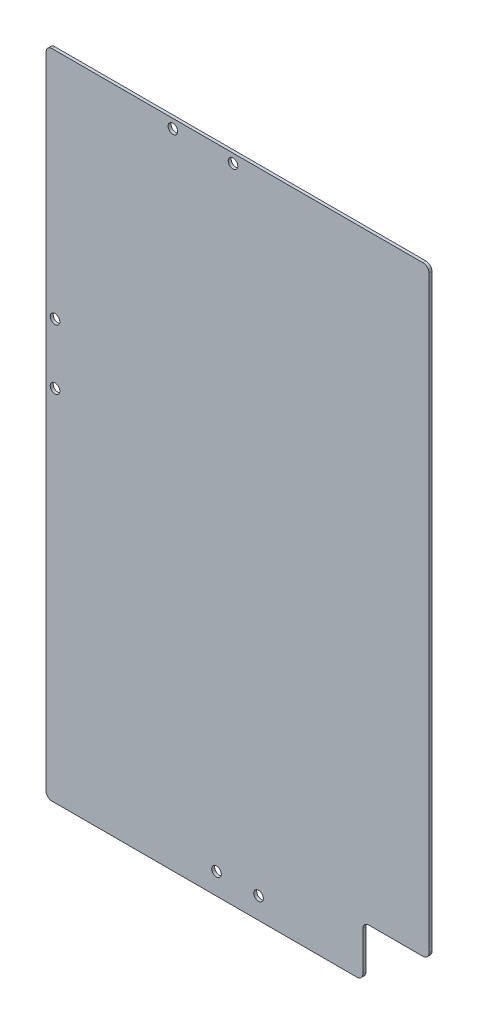
ISO-10303-21;
HEADER;
FILE_DESCRIPTION(('STEP AP214'),'2;1');
FILE_NAME('part.step','',(''),(''),'','','');
FILE_SCHEMA(('AUTOMOTIVE_DESIGN { 1 0 10303 214 1 1 1 1 }'));
ENDSEC;
DATA;
#1=APPLICATION_CONTEXT('core data for automotive mechanical design processes');
#2=APPLICATION_PROTOCOL_DEFINITION('international standard','automotive_design',2000,#1);
#3=PRODUCT_CONTEXT('',#1,'mechanical');
#4=PRODUCT('Part','Part','',(#3));
#5=PRODUCT_RELATED_PRODUCT_CATEGORY('part','',(#4));
#6=PRODUCT_DEFINITION_FORMATION('','',#4);
#7=PRODUCT_DEFINITION_CONTEXT('part definition',#1,'design');
#8=PRODUCT_DEFINITION('design','',#6,#7);
#9=PRODUCT_DEFINITION_SHAPE('','',#8);
#10=(LENGTH_UNIT() NAMED_UNIT(*) SI_UNIT(.MILLI.,.METRE.));
#11=(NAMED_UNIT(*) PLANE_ANGLE_UNIT() SI_UNIT($,.RADIAN.));
#12=(NAMED_UNIT(*) SI_UNIT($,.STERADIAN.) SOLID_ANGLE_UNIT());
#13=UNCERTAINTY_MEASURE_WITH_UNIT(LENGTH_MEASURE(1.E-05),#10,'distance_accuracy_value','');
#14=(GEOMETRIC_REPRESENTATION_CONTEXT(3) GLOBAL_UNCERTAINTY_ASSIGNED_CONTEXT((#13)) GLOBAL_UNIT_ASSIGNED_CONTEXT((#10,
#11,#12)) REPRESENTATION_CONTEXT('',''));
#15=CARTESIAN_POINT('',(0.,0.,0.));
#16=DIRECTION('',(0.,0.,1.));
#17=DIRECTION('',(1.,0.,0.));
#18=AXIS2_PLACEMENT_3D('',#15,#16,#17);
#19=CARTESIAN_POINT('',(0.,0.,1.));
#20=DIRECTION('',(0.,0.,-1.));
#21=DIRECTION('',(-1.,0.,0.));
#22=AXIS2_PLACEMENT_3D('',#19,#20,#21);
#23=PLANE('',#22);
#24=CARTESIAN_POINT('',(7.,-117.4,0.999999999999999));
#25=DIRECTION('',(0.,0.,-1.));
#26=DIRECTION('',(-1.,0.,0.));
#27=AXIS2_PLACEMENT_3D('',#24,#25,#26);
#28=CIRCLE('',#27,1.60000000000001);
#29=CARTESIAN_POINT('',(5.39999999999999,-117.4,0.999999999999999));
#30=VERTEX_POINT('',#29);
#31=EDGE_CURVE('E309',#30,#30,#28,.T.);
#32=ORIENTED_EDGE('',*,*,#31,.T.);
#33=EDGE_LOOP('',(#32));
#34=FACE_BOUND('',#33,.T.);
#35=CARTESIAN_POINT('',(-7.,-117.4,0.999999999999999));
#36=DIRECTION('',(0.,0.,-1.));
#37=DIRECTION('',(-1.,0.,0.));
#38=AXIS2_PLACEMENT_3D('',#35,#36,#37);
#39=CIRCLE('',#38,1.6);
#40=CARTESIAN_POINT('',(-8.6,-117.4,0.999999999999999));
#41=VERTEX_POINT('',#40);
#42=EDGE_CURVE('E314',#41,#41,#39,.T.);
#43=ORIENTED_EDGE('',*,*,#42,.T.);
#44=EDGE_LOOP('',(#43));
#45=FACE_BOUND('',#44,.T.);
#46=DIRECTION('',(0.,-1.,0.));
#47=VECTOR('',#46,1.);
#48=CARTESIAN_POINT('',(-63.75,-92.5,1.));
#49=LINE('',#48,#47);
#50=CARTESIAN_POINT('',(-63.75,90.5,1.));
#51=VERTEX_POINT('',#50);
#52=CARTESIAN_POINT('',(-63.75,-122.5,1.));
#53=VERTEX_POINT('',#52);
#54=EDGE_CURVE('E266',#51,#53,#49,.T.);
#55=ORIENTED_EDGE('',*,*,#54,.T.);
#56=CARTESIAN_POINT('',(-61.75,-122.5,0.999999999999999));
#57=DIRECTION('',(0.,0.,-1.));
#58=DIRECTION('',(-1.,0.,0.));
#59=AXIS2_PLACEMENT_3D('',#56,#57,#58);
#60=CIRCLE('',#59,2.);
#61=CARTESIAN_POINT('',(-61.75,-124.5,1.));
#62=VERTEX_POINT('',#61);
#63=EDGE_CURVE('E196',#53,#62,#60,.F.);
#64=ORIENTED_EDGE('',*,*,#63,.T.);
#65=DIRECTION('',(1.,0.,0.));
#66=VECTOR('',#65,1.);
#67=CARTESIAN_POINT('',(0.,-124.5,1.));
#68=LINE('',#67,#66);
#69=CARTESIAN_POINT('',(39.75,-124.5,1.));
#70=VERTEX_POINT('',#69);
#71=EDGE_CURVE('E154',#62,#70,#68,.T.);
#72=ORIENTED_EDGE('',*,*,#71,.T.);
#73=CARTESIAN_POINT('',(39.75,-122.5,0.999999999999999));
#74=DIRECTION('',(0.,0.,-1.));
#75=DIRECTION('',(-1.,0.,0.));
#76=AXIS2_PLACEMENT_3D('',#73,#74,#75);
#77=CIRCLE('',#76,2.);
#78=CARTESIAN_POINT('',(41.75,-122.5,1.));
#79=VERTEX_POINT('',#78);
#80=EDGE_CURVE('E191',#70,#79,#77,.F.);
#81=ORIENTED_EDGE('',*,*,#80,.T.);
#82=DIRECTION('',(0.,-1.,0.));
#83=VECTOR('',#82,1.);
#84=CARTESIAN_POINT('',(41.75,-124.5,1.));
#85=LINE('',#84,#83);
#86=CARTESIAN_POINT('',(41.75,-109.5,1.));
#87=VERTEX_POINT('',#86);
#88=EDGE_CURVE('E222',#87,#79,#85,.T.);
#89=ORIENTED_EDGE('',*,*,#88,.F.);
#90=CARTESIAN_POINT('',(43.75,-109.5,1.));
#91=DIRECTION('',(0.,0.,-1.));
#92=DIRECTION('',(-1.,0.,0.));
#93=AXIS2_PLACEMENT_3D('',#90,#91,#92);
#94=CIRCLE('',#93,2.);
#95=CARTESIAN_POINT('',(43.75,-107.5,1.));
#96=VERTEX_POINT('',#95);
#97=EDGE_CURVE('E50',#87,#96,#94,.T.);
#98=ORIENTED_EDGE('',*,*,#97,.T.);
#99=DIRECTION('',(-1.,0.,0.));
#100=VECTOR('',#99,1.);
#101=CARTESIAN_POINT('',(63.75,-107.5,1.));
#102=LINE('',#101,#100);
#103=CARTESIAN_POINT('',(61.75,-107.5,1.));
#104=VERTEX_POINT('',#103);
#105=EDGE_CURVE('E220',#104,#96,#102,.T.);
#106=ORIENTED_EDGE('',*,*,#105,.F.);
#107=CARTESIAN_POINT('',(61.75,-105.5,1.));
#108=DIRECTION('',(0.,0.,-1.));
#109=DIRECTION('',(-1.,0.,0.));
#110=AXIS2_PLACEMENT_3D('',#107,#108,#109);
#111=CIRCLE('',#110,2.);
#112=CARTESIAN_POINT('',(63.75,-105.5,1.));
#113=VERTEX_POINT('',#112);
#114=EDGE_CURVE('E193',#104,#113,#111,.F.);
#115=ORIENTED_EDGE('',*,*,#114,.T.);
#116=DIRECTION('',(0.,1.,0.));
#117=VECTOR('',#116,1.);
#118=CARTESIAN_POINT('',(63.75,-92.5,1.));
#119=LINE('',#118,#117);
#120=CARTESIAN_POINT('',(63.75,90.5,1.));
#121=VERTEX_POINT('',#120);
#122=EDGE_CURVE('E274',#113,#121,#119,.T.);
#123=ORIENTED_EDGE('',*,*,#122,.T.);
#124=CARTESIAN_POINT('',(61.75,90.5,1.));
#125=DIRECTION('',(0.,0.,-1.));
#126=DIRECTION('',(-1.,0.,0.));
#127=AXIS2_PLACEMENT_3D('',#124,#125,#126);
#128=CIRCLE('',#127,2.);
#129=CARTESIAN_POINT('',(61.75,92.5,1.));
#130=VERTEX_POINT('',#129);
#131=EDGE_CURVE('E64',#121,#130,#128,.F.);
#132=ORIENTED_EDGE('',*,*,#131,.T.);
#133=DIRECTION('',(-1.,0.,0.));
#134=VECTOR('',#133,1.);
#135=CARTESIAN_POINT('',(-63.75,92.5,1.));
#136=LINE('',#135,#134);
#137=CARTESIAN_POINT('',(-61.75,92.5,1.));
#138=VERTEX_POINT('',#137);
#139=EDGE_CURVE('E275',#130,#138,#136,.T.);
#140=ORIENTED_EDGE('',*,*,#139,.T.);
#141=CARTESIAN_POINT('',(-61.75,90.5,1.));
#142=DIRECTION('',(0.,0.,-1.));
#143=DIRECTION('',(-1.,0.,0.));
#144=AXIS2_PLACEMENT_3D('',#141,#142,#143);
#145=CIRCLE('',#144,2.);
#146=EDGE_CURVE('E189',#138,#51,#145,.F.);
#147=ORIENTED_EDGE('',*,*,#146,.T.);
#148=EDGE_LOOP('',(#55,#64,#72,#81,#89,#98,#106,#115,#123,#132,#140,#147));
#149=FACE_BOUND('',#148,.T.);
#150=CARTESIAN_POINT('',(-21.5,89.5,1.));
#151=DIRECTION('',(0.,0.,1.));
#152=DIRECTION('',(1.,0.,0.));
#153=AXIS2_PLACEMENT_3D('',#150,#151,#152);
#154=CIRCLE('',#153,1.60000000000001);
#155=CARTESIAN_POINT('',(-19.9,89.5,1.));
#156=VERTEX_POINT('',#155);
#157=EDGE_CURVE('E265',#156,#156,#154,.T.);
#158=ORIENTED_EDGE('',*,*,#157,.F.);
#159=EDGE_LOOP('',(#158));
#160=FACE_BOUND('',#159,.T.);
#161=CARTESIAN_POINT('',(-1.5,89.5,1.));
#162=DIRECTION('',(0.,0.,1.));
#163=DIRECTION('',(1.,0.,0.));
#164=AXIS2_PLACEMENT_3D('',#161,#162,#163);
#165=CIRCLE('',#164,1.6);
#166=CARTESIAN_POINT('',(0.100000000000003,89.5,1.));
#167=VERTEX_POINT('',#166);
#168=EDGE_CURVE('E285',#167,#167,#165,.T.);
#169=ORIENTED_EDGE('',*,*,#168,.F.);
#170=EDGE_LOOP('',(#169));
#171=FACE_BOUND('',#170,.T.);
#172=CARTESIAN_POINT('',(-60.75,15.,1.));
#173=DIRECTION('',(0.,0.,1.));
#174=DIRECTION('',(1.,0.,0.));
#175=AXIS2_PLACEMENT_3D('',#172,#173,#174);
#176=CIRCLE('',#175,1.6);
#177=CARTESIAN_POINT('',(-59.15,15.,1.));
#178=VERTEX_POINT('',#177);
#179=EDGE_CURVE('E295',#178,#178,#176,.T.);
#180=ORIENTED_EDGE('',*,*,#179,.F.);
#181=EDGE_LOOP('',(#180));
#182=FACE_BOUND('',#181,.T.);
#183=CARTESIAN_POINT('',(-60.75,-5.,1.));
#184=DIRECTION('',(0.,0.,1.));
#185=DIRECTION('',(1.,0.,0.));
#186=AXIS2_PLACEMENT_3D('',#183,#184,#185);
#187=CIRCLE('',#186,1.6);
#188=CARTESIAN_POINT('',(-59.15,-5.,1.));
#189=VERTEX_POINT('',#188);
#190=EDGE_CURVE('E302',#189,#189,#187,.T.);
#191=ORIENTED_EDGE('',*,*,#190,.F.);
#192=EDGE_LOOP('',(#191));
#193=FACE_BOUND('',#192,.T.);
#194=ADVANCED_FACE('F41',(#34,#45,#149,#160,#171,#182,#193),#23,.F.);
#195=CARTESIAN_POINT('',(0.,0.,0.));
#196=DIRECTION('',(0.,0.,-1.));
#197=DIRECTION('',(-1.,0.,0.));
#198=AXIS2_PLACEMENT_3D('',#195,#196,#197);
#199=PLANE('',#198);
#200=DIRECTION('',(1.,0.,0.));
#201=VECTOR('',#200,1.);
#202=CARTESIAN_POINT('',(63.75,-124.5,0.));
#203=LINE('',#202,#201);
#204=CARTESIAN_POINT('',(-61.75,-124.5,0.));
#205=VERTEX_POINT('',#204);
#206=CARTESIAN_POINT('',(39.75,-124.5,0.));
#207=VERTEX_POINT('',#206);
#208=EDGE_CURVE('E151',#205,#207,#203,.T.);
#209=ORIENTED_EDGE('',*,*,#208,.F.);
#210=CARTESIAN_POINT('',(-61.75,-122.5,0.));
#211=DIRECTION('',(0.,0.,-1.));
#212=DIRECTION('',(-1.,0.,0.));
#213=AXIS2_PLACEMENT_3D('',#210,#211,#212);
#214=CIRCLE('',#213,2.);
#215=CARTESIAN_POINT('',(-63.75,-122.5,0.));
#216=VERTEX_POINT('',#215);
#217=EDGE_CURVE('E132',#205,#216,#214,.T.);
#218=ORIENTED_EDGE('',*,*,#217,.T.);
#219=DIRECTION('',(0.,-1.,0.));
#220=VECTOR('',#219,1.);
#221=CARTESIAN_POINT('',(-63.75,-92.5,0.));
#222=LINE('',#221,#220);
#223=CARTESIAN_POINT('',(-63.75,90.5,0.));
#224=VERTEX_POINT('',#223);
#225=EDGE_CURVE('E270',#224,#216,#222,.T.);
#226=ORIENTED_EDGE('',*,*,#225,.F.);
#227=CARTESIAN_POINT('',(-61.75,90.5,0.));
#228=DIRECTION('',(0.,0.,-1.));
#229=DIRECTION('',(-1.,0.,0.));
#230=AXIS2_PLACEMENT_3D('',#227,#228,#229);
#231=CIRCLE('',#230,2.);
#232=CARTESIAN_POINT('',(-61.75,92.5,0.));
#233=VERTEX_POINT('',#232);
#234=EDGE_CURVE('E155',#224,#233,#231,.T.);
#235=ORIENTED_EDGE('',*,*,#234,.T.);
#236=DIRECTION('',(-1.,0.,0.));
#237=VECTOR('',#236,1.);
#238=CARTESIAN_POINT('',(-63.75,92.5,0.));
#239=LINE('',#238,#237);
#240=CARTESIAN_POINT('',(61.75,92.5,0.));
#241=VERTEX_POINT('',#240);
#242=EDGE_CURVE('E264',#241,#233,#239,.T.);
#243=ORIENTED_EDGE('',*,*,#242,.F.);
#244=CARTESIAN_POINT('',(61.75,90.5,0.));
#245=DIRECTION('',(0.,0.,-1.));
#246=DIRECTION('',(-1.,0.,0.));
#247=AXIS2_PLACEMENT_3D('',#244,#245,#246);
#248=CIRCLE('',#247,2.);
#249=CARTESIAN_POINT('',(63.75,90.5,0.));
#250=VERTEX_POINT('',#249);
#251=EDGE_CURVE('E144',#241,#250,#248,.T.);
#252=ORIENTED_EDGE('',*,*,#251,.T.);
#253=DIRECTION('',(0.,1.,0.));
#254=VECTOR('',#253,1.);
#255=CARTESIAN_POINT('',(63.75,-92.5,0.));
#256=LINE('',#255,#254);
#257=CARTESIAN_POINT('',(63.75,-105.5,0.));
#258=VERTEX_POINT('',#257);
#259=EDGE_CURVE('E258',#258,#250,#256,.T.);
#260=ORIENTED_EDGE('',*,*,#259,.F.);
#261=CARTESIAN_POINT('',(61.75,-105.5,0.));
#262=DIRECTION('',(0.,0.,-1.));
#263=DIRECTION('',(-1.,0.,0.));
#264=AXIS2_PLACEMENT_3D('',#261,#262,#263);
#265=CIRCLE('',#264,2.);
#266=CARTESIAN_POINT('',(61.75,-107.5,0.));
#267=VERTEX_POINT('',#266);
#268=EDGE_CURVE('E250',#258,#267,#265,.T.);
#269=ORIENTED_EDGE('',*,*,#268,.T.);
#270=DIRECTION('',(1.,0.,0.));
#271=VECTOR('',#270,1.);
#272=CARTESIAN_POINT('',(0.,-107.5,0.));
#273=LINE('',#272,#271);
#274=CARTESIAN_POINT('',(43.75,-107.5,0.));
#275=VERTEX_POINT('',#274);
#276=EDGE_CURVE('E164',#275,#267,#273,.T.);
#277=ORIENTED_EDGE('',*,*,#276,.F.);
#278=CARTESIAN_POINT('',(43.75,-109.5,0.));
#279=DIRECTION('',(0.,0.,-1.));
#280=DIRECTION('',(-1.,0.,0.));
#281=AXIS2_PLACEMENT_3D('',#278,#279,#280);
#282=CIRCLE('',#281,2.);
#283=CARTESIAN_POINT('',(41.75,-109.5,0.));
#284=VERTEX_POINT('',#283);
#285=EDGE_CURVE('E12',#275,#284,#282,.F.);
#286=ORIENTED_EDGE('',*,*,#285,.T.);
#287=DIRECTION('',(0.,1.,0.));
#288=VECTOR('',#287,1.);
#289=CARTESIAN_POINT('',(41.75,0.,0.));
#290=LINE('',#289,#288);
#291=CARTESIAN_POINT('',(41.75,-122.5,0.));
#292=VERTEX_POINT('',#291);
#293=EDGE_CURVE('E170',#292,#284,#290,.T.);
#294=ORIENTED_EDGE('',*,*,#293,.F.);
#295=CARTESIAN_POINT('',(39.75,-122.5,0.));
#296=DIRECTION('',(0.,0.,-1.));
#297=DIRECTION('',(-1.,0.,0.));
#298=AXIS2_PLACEMENT_3D('',#295,#296,#297);
#299=CIRCLE('',#298,2.);
#300=EDGE_CURVE('E162',#292,#207,#299,.T.);
#301=ORIENTED_EDGE('',*,*,#300,.T.);
#302=EDGE_LOOP('',(#209,#218,#226,#235,#243,#252,#260,#269,#277,#286,#294,#301));
#303=FACE_BOUND('',#302,.T.);
#304=CARTESIAN_POINT('',(7.,-117.4,0.));
#305=DIRECTION('',(0.,0.,-1.));
#306=DIRECTION('',(-1.,0.,0.));
#307=AXIS2_PLACEMENT_3D('',#304,#305,#306);
#308=CIRCLE('',#307,1.60000000000001);
#309=CARTESIAN_POINT('',(5.39999999999999,-117.4,0.));
#310=VERTEX_POINT('',#309);
#311=EDGE_CURVE('E317',#310,#310,#308,.T.);
#312=ORIENTED_EDGE('',*,*,#311,.F.);
#313=EDGE_LOOP('',(#312));
#314=FACE_BOUND('',#313,.T.);
#315=CARTESIAN_POINT('',(-7.,-117.4,0.));
#316=DIRECTION('',(0.,0.,-1.));
#317=DIRECTION('',(-1.,0.,0.));
#318=AXIS2_PLACEMENT_3D('',#315,#316,#317);
#319=CIRCLE('',#318,1.6);
#320=CARTESIAN_POINT('',(-8.6,-117.4,0.));
#321=VERTEX_POINT('',#320);
#322=EDGE_CURVE('E166',#321,#321,#319,.T.);
#323=ORIENTED_EDGE('',*,*,#322,.F.);
#324=EDGE_LOOP('',(#323));
#325=FACE_BOUND('',#324,.T.);
#326=CARTESIAN_POINT('',(-60.75,15.,0.));
#327=DIRECTION('',(0.,0.,1.));
#328=DIRECTION('',(1.,0.,0.));
#329=AXIS2_PLACEMENT_3D('',#326,#327,#328);
#330=CIRCLE('',#329,1.6);
#331=CARTESIAN_POINT('',(-59.15,15.,0.));
#332=VERTEX_POINT('',#331);
#333=EDGE_CURVE('E297',#332,#332,#330,.T.);
#334=ORIENTED_EDGE('',*,*,#333,.T.);
#335=EDGE_LOOP('',(#334));
#336=FACE_BOUND('',#335,.T.);
#337=CARTESIAN_POINT('',(-21.5,89.5,0.));
#338=DIRECTION('',(0.,0.,1.));
#339=DIRECTION('',(1.,0.,0.));
#340=AXIS2_PLACEMENT_3D('',#337,#338,#339);
#341=CIRCLE('',#340,1.60000000000001);
#342=CARTESIAN_POINT('',(-19.9,89.5,0.));
#343=VERTEX_POINT('',#342);
#344=EDGE_CURVE('E280',#343,#343,#341,.T.);
#345=ORIENTED_EDGE('',*,*,#344,.T.);
#346=EDGE_LOOP('',(#345));
#347=FACE_BOUND('',#346,.T.);
#348=CARTESIAN_POINT('',(-1.5,89.5,0.));
#349=DIRECTION('',(0.,0.,1.));
#350=DIRECTION('',(1.,0.,0.));
#351=AXIS2_PLACEMENT_3D('',#348,#349,#350);
#352=CIRCLE('',#351,1.6);
#353=CARTESIAN_POINT('',(0.100000000000003,89.5,0.));
#354=VERTEX_POINT('',#353);
#355=EDGE_CURVE('E290',#354,#354,#352,.T.);
#356=ORIENTED_EDGE('',*,*,#355,.T.);
#357=EDGE_LOOP('',(#356));
#358=FACE_BOUND('',#357,.T.);
#359=CARTESIAN_POINT('',(-60.75,-5.,0.));
#360=DIRECTION('',(0.,0.,1.));
#361=DIRECTION('',(1.,0.,0.));
#362=AXIS2_PLACEMENT_3D('',#359,#360,#361);
#363=CIRCLE('',#362,1.6);
#364=CARTESIAN_POINT('',(-59.15,-5.,0.));
#365=VERTEX_POINT('',#364);
#366=EDGE_CURVE('E304',#365,#365,#363,.T.);
#367=ORIENTED_EDGE('',*,*,#366,.T.);
#368=EDGE_LOOP('',(#367));
#369=FACE_BOUND('',#368,.T.);
#370=ADVANCED_FACE('F158',(#303,#314,#325,#336,#347,#358,#369),#199,.T.);
#371=CARTESIAN_POINT('',(63.75,-92.5,1.));
#372=DIRECTION('',(-1.,0.,0.));
#373=DIRECTION('',(0.,0.,1.));
#374=AXIS2_PLACEMENT_3D('',#371,#372,#373);
#375=PLANE('',#374);
#376=ORIENTED_EDGE('',*,*,#259,.T.);
#377=DIRECTION('',(0.,0.,-1.));
#378=VECTOR('',#377,1.);
#379=CARTESIAN_POINT('',(63.75,90.5,1.));
#380=LINE('',#379,#378);
#381=EDGE_CURVE('E204',#250,#121,#380,.F.);
#382=ORIENTED_EDGE('',*,*,#381,.T.);
#383=ORIENTED_EDGE('',*,*,#122,.F.);
#384=DIRECTION('',(0.,0.,1.));
#385=VECTOR('',#384,1.);
#386=CARTESIAN_POINT('',(63.75,-105.5,1.));
#387=LINE('',#386,#385);
#388=EDGE_CURVE('E202',#113,#258,#387,.F.);
#389=ORIENTED_EDGE('',*,*,#388,.T.);
#390=EDGE_LOOP('',(#376,#382,#383,#389));
#391=FACE_BOUND('',#390,.T.);
#392=ADVANCED_FACE('F330',(#391),#375,.F.);
#393=CARTESIAN_POINT('',(-63.75,92.5,1.));
#394=DIRECTION('',(0.,-1.,0.));
#395=DIRECTION('',(0.,0.,-1.));
#396=AXIS2_PLACEMENT_3D('',#393,#394,#395);
#397=PLANE('',#396);
#398=ORIENTED_EDGE('',*,*,#139,.F.);
#399=DIRECTION('',(0.,0.,-1.));
#400=VECTOR('',#399,1.);
#401=CARTESIAN_POINT('',(61.75,92.5,1.));
#402=LINE('',#401,#400);
#403=EDGE_CURVE('E199',#130,#241,#402,.T.);
#404=ORIENTED_EDGE('',*,*,#403,.T.);
#405=ORIENTED_EDGE('',*,*,#242,.T.);
#406=DIRECTION('',(0.,0.,-1.));
#407=VECTOR('',#406,1.);
#408=CARTESIAN_POINT('',(-61.75,92.5,1.));
#409=LINE('',#408,#407);
#410=EDGE_CURVE('E57',#233,#138,#409,.F.);
#411=ORIENTED_EDGE('',*,*,#410,.T.);
#412=EDGE_LOOP('',(#398,#404,#405,#411));
#413=FACE_BOUND('',#412,.T.);
#414=ADVANCED_FACE('F370',(#413),#397,.F.);
#415=CARTESIAN_POINT('',(-63.75,-92.5,1.));
#416=DIRECTION('',(1.,0.,0.));
#417=DIRECTION('',(0.,0.,-1.));
#418=AXIS2_PLACEMENT_3D('',#415,#416,#417);
#419=PLANE('',#418);
#420=ORIENTED_EDGE('',*,*,#225,.T.);
#421=DIRECTION('',(0.,0.,-1.));
#422=VECTOR('',#421,1.);
#423=CARTESIAN_POINT('',(-63.75,-122.5,1.));
#424=LINE('',#423,#422);
#425=EDGE_CURVE('E137',#216,#53,#424,.F.);
#426=ORIENTED_EDGE('',*,*,#425,.T.);
#427=ORIENTED_EDGE('',*,*,#54,.F.);
#428=DIRECTION('',(0.,0.,-1.));
#429=VECTOR('',#428,1.);
#430=CARTESIAN_POINT('',(-63.75,90.5,1.));
#431=LINE('',#430,#429);
#432=EDGE_CURVE('E143',#51,#224,#431,.T.);
#433=ORIENTED_EDGE('',*,*,#432,.T.);
#434=EDGE_LOOP('',(#420,#426,#427,#433));
#435=FACE_BOUND('',#434,.T.);
#436=ADVANCED_FACE('F367',(#435),#419,.F.);
#437=CARTESIAN_POINT('',(-21.5,89.5,1.));
#438=DIRECTION('',(0.,0.,-1.));
#439=DIRECTION('',(-1.,0.,0.));
#440=AXIS2_PLACEMENT_3D('',#437,#438,#439);
#441=CYLINDRICAL_SURFACE('',#440,1.60000000000001);
#442=ORIENTED_EDGE('',*,*,#157,.T.);
#443=EDGE_LOOP('',(#442));
#444=FACE_BOUND('',#443,.T.);
#445=ORIENTED_EDGE('',*,*,#344,.F.);
#446=EDGE_LOOP('',(#445));
#447=FACE_BOUND('',#446,.T.);
#448=ADVANCED_FACE('F364',(#444,#447),#441,.F.);
#449=CARTESIAN_POINT('',(-1.5,89.5,1.));
#450=DIRECTION('',(0.,0.,-1.));
#451=DIRECTION('',(-1.,0.,0.));
#452=AXIS2_PLACEMENT_3D('',#449,#450,#451);
#453=CYLINDRICAL_SURFACE('',#452,1.6);
#454=ORIENTED_EDGE('',*,*,#168,.T.);
#455=EDGE_LOOP('',(#454));
#456=FACE_BOUND('',#455,.T.);
#457=ORIENTED_EDGE('',*,*,#355,.F.);
#458=EDGE_LOOP('',(#457));
#459=FACE_BOUND('',#458,.T.);
#460=ADVANCED_FACE('F354',(#456,#459),#453,.F.);
#461=CARTESIAN_POINT('',(-60.75,15.,1.));
#462=DIRECTION('',(0.,0.,-1.));
#463=DIRECTION('',(-1.,0.,0.));
#464=AXIS2_PLACEMENT_3D('',#461,#462,#463);
#465=CYLINDRICAL_SURFACE('',#464,1.6);
#466=ORIENTED_EDGE('',*,*,#179,.T.);
#467=EDGE_LOOP('',(#466));
#468=FACE_BOUND('',#467,.T.);
#469=ORIENTED_EDGE('',*,*,#333,.F.);
#470=EDGE_LOOP('',(#469));
#471=FACE_BOUND('',#470,.T.);
#472=ADVANCED_FACE('F345',(#468,#471),#465,.F.);
#473=CARTESIAN_POINT('',(-60.75,-5.,1.));
#474=DIRECTION('',(0.,0.,-1.));
#475=DIRECTION('',(-1.,0.,0.));
#476=AXIS2_PLACEMENT_3D('',#473,#474,#475);
#477=CYLINDRICAL_SURFACE('',#476,1.6);
#478=ORIENTED_EDGE('',*,*,#190,.T.);
#479=EDGE_LOOP('',(#478));
#480=FACE_BOUND('',#479,.T.);
#481=ORIENTED_EDGE('',*,*,#366,.F.);
#482=EDGE_LOOP('',(#481));
#483=FACE_BOUND('',#482,.T.);
#484=ADVANCED_FACE('F342',(#480,#483),#477,.F.);
#485=CARTESIAN_POINT('',(-7.,-117.4,10.));
#486=DIRECTION('',(0.,0.,-1.));
#487=DIRECTION('',(-1.,0.,0.));
#488=AXIS2_PLACEMENT_3D('',#485,#486,#487);
#489=CYLINDRICAL_SURFACE('',#488,1.6);
#490=ORIENTED_EDGE('',*,*,#322,.T.);
#491=EDGE_LOOP('',(#490));
#492=FACE_BOUND('',#491,.T.);
#493=ORIENTED_EDGE('',*,*,#42,.F.);
#494=EDGE_LOOP('',(#493));
#495=FACE_BOUND('',#494,.T.);
#496=ADVANCED_FACE('F344',(#492,#495),#489,.F.);
#497=CARTESIAN_POINT('',(7.,-117.4,10.));
#498=DIRECTION('',(0.,0.,-1.));
#499=DIRECTION('',(-1.,0.,0.));
#500=AXIS2_PLACEMENT_3D('',#497,#498,#499);
#501=CYLINDRICAL_SURFACE('',#500,1.60000000000001);
#502=ORIENTED_EDGE('',*,*,#311,.T.);
#503=EDGE_LOOP('',(#502));
#504=FACE_BOUND('',#503,.T.);
#505=ORIENTED_EDGE('',*,*,#31,.F.);
#506=EDGE_LOOP('',(#505));
#507=FACE_BOUND('',#506,.T.);
#508=ADVANCED_FACE('F326',(#504,#507),#501,.F.);
#509=CARTESIAN_POINT('',(63.75,-124.5,10.));
#510=DIRECTION('',(0.,1.,0.));
#511=DIRECTION('',(0.,0.,1.));
#512=AXIS2_PLACEMENT_3D('',#509,#510,#511);
#513=PLANE('',#512);
#514=ORIENTED_EDGE('',*,*,#71,.F.);
#515=DIRECTION('',(0.,0.,-1.));
#516=VECTOR('',#515,1.);
#517=CARTESIAN_POINT('',(-61.75,-124.5,10.));
#518=LINE('',#517,#516);
#519=EDGE_CURVE('E136',#62,#205,#518,.T.);
#520=ORIENTED_EDGE('',*,*,#519,.T.);
#521=ORIENTED_EDGE('',*,*,#208,.T.);
#522=DIRECTION('',(0.,0.,1.));
#523=VECTOR('',#522,1.);
#524=CARTESIAN_POINT('',(39.75,-124.5,10.));
#525=LINE('',#524,#523);
#526=EDGE_CURVE('E156',#207,#70,#525,.T.);
#527=ORIENTED_EDGE('',*,*,#526,.T.);
#528=EDGE_LOOP('',(#514,#520,#521,#527));
#529=FACE_BOUND('',#528,.T.);
#530=ADVANCED_FACE('F149',(#529),#513,.F.);
#531=CARTESIAN_POINT('',(41.75,-124.5,-9.));
#532=DIRECTION('',(-1.,0.,0.));
#533=DIRECTION('',(0.,0.,1.));
#534=AXIS2_PLACEMENT_3D('',#531,#532,#533);
#535=PLANE('',#534);
#536=ORIENTED_EDGE('',*,*,#293,.T.);
#537=DIRECTION('',(0.,0.,1.));
#538=VECTOR('',#537,1.);
#539=CARTESIAN_POINT('',(41.75,-109.5,1.));
#540=LINE('',#539,#538);
#541=EDGE_CURVE('E213',#284,#87,#540,.T.);
#542=ORIENTED_EDGE('',*,*,#541,.T.);
#543=ORIENTED_EDGE('',*,*,#88,.T.);
#544=DIRECTION('',(0.,0.,1.));
#545=VECTOR('',#544,1.);
#546=CARTESIAN_POINT('',(41.75,-122.5,-9.));
#547=LINE('',#546,#545);
#548=EDGE_CURVE('E211',#79,#292,#547,.F.);
#549=ORIENTED_EDGE('',*,*,#548,.T.);
#550=EDGE_LOOP('',(#536,#542,#543,#549));
#551=FACE_BOUND('',#550,.T.);
#552=ADVANCED_FACE('F235',(#551),#535,.F.);
#553=CARTESIAN_POINT('',(63.75,-107.5,-9.));
#554=DIRECTION('',(0.,1.,0.));
#555=DIRECTION('',(-1.,0.,0.));
#556=AXIS2_PLACEMENT_3D('',#553,#554,#555);
#557=PLANE('',#556);
#558=ORIENTED_EDGE('',*,*,#276,.T.);
#559=DIRECTION('',(0.,0.,1.));
#560=VECTOR('',#559,1.);
#561=CARTESIAN_POINT('',(61.75,-107.5,-9.));
#562=LINE('',#561,#560);
#563=EDGE_CURVE('E208',#267,#104,#562,.T.);
#564=ORIENTED_EDGE('',*,*,#563,.T.);
#565=ORIENTED_EDGE('',*,*,#105,.T.);
#566=DIRECTION('',(0.,0.,1.));
#567=VECTOR('',#566,1.);
#568=CARTESIAN_POINT('',(43.75,-107.5,0.));
#569=LINE('',#568,#567);
#570=EDGE_CURVE('E206',#96,#275,#569,.F.);
#571=ORIENTED_EDGE('',*,*,#570,.T.);
#572=EDGE_LOOP('',(#558,#564,#565,#571));
#573=FACE_BOUND('',#572,.T.);
#574=ADVANCED_FACE('F227',(#573),#557,.F.);
#575=CARTESIAN_POINT('',(-61.75,-122.5,10.));
#576=DIRECTION('',(0.,0.,-1.));
#577=DIRECTION('',(-1.,0.,0.));
#578=AXIS2_PLACEMENT_3D('',#575,#576,#577);
#579=CYLINDRICAL_SURFACE('',#578,2.);
#580=ORIENTED_EDGE('',*,*,#63,.F.);
#581=ORIENTED_EDGE('',*,*,#425,.F.);
#582=ORIENTED_EDGE('',*,*,#217,.F.);
#583=ORIENTED_EDGE('',*,*,#519,.F.);
#584=EDGE_LOOP('',(#580,#581,#582,#583));
#585=FACE_BOUND('',#584,.T.);
#586=ADVANCED_FACE('F135',(#585),#579,.T.);
#587=CARTESIAN_POINT('',(61.75,90.5,1.));
#588=DIRECTION('',(0.,0.,-1.));
#589=DIRECTION('',(-1.,0.,0.));
#590=AXIS2_PLACEMENT_3D('',#587,#588,#589);
#591=CYLINDRICAL_SURFACE('',#590,2.);
#592=ORIENTED_EDGE('',*,*,#131,.F.);
#593=ORIENTED_EDGE('',*,*,#381,.F.);
#594=ORIENTED_EDGE('',*,*,#251,.F.);
#595=ORIENTED_EDGE('',*,*,#403,.F.);
#596=EDGE_LOOP('',(#592,#593,#594,#595));
#597=FACE_BOUND('',#596,.T.);
#598=ADVANCED_FACE('F379',(#597),#591,.T.);
#599=CARTESIAN_POINT('',(61.75,-105.5,-9.));
#600=DIRECTION('',(0.,0.,1.));
#601=DIRECTION('',(1.,0.,0.));
#602=AXIS2_PLACEMENT_3D('',#599,#600,#601);
#603=CYLINDRICAL_SURFACE('',#602,2.);
#604=ORIENTED_EDGE('',*,*,#268,.F.);
#605=ORIENTED_EDGE('',*,*,#388,.F.);
#606=ORIENTED_EDGE('',*,*,#114,.F.);
#607=ORIENTED_EDGE('',*,*,#563,.F.);
#608=EDGE_LOOP('',(#604,#605,#606,#607));
#609=FACE_BOUND('',#608,.T.);
#610=ADVANCED_FACE('F382',(#609),#603,.T.);
#611=CARTESIAN_POINT('',(43.75,-109.5,-9.));
#612=DIRECTION('',(0.,0.,-1.));
#613=DIRECTION('',(-1.,0.,0.));
#614=AXIS2_PLACEMENT_3D('',#611,#612,#613);
#615=CYLINDRICAL_SURFACE('',#614,2.);
#616=ORIENTED_EDGE('',*,*,#285,.F.);
#617=ORIENTED_EDGE('',*,*,#570,.F.);
#618=ORIENTED_EDGE('',*,*,#97,.F.);
#619=ORIENTED_EDGE('',*,*,#541,.F.);
#620=EDGE_LOOP('',(#616,#617,#618,#619));
#621=FACE_BOUND('',#620,.T.);
#622=ADVANCED_FACE('F232',(#621),#615,.F.);
#623=CARTESIAN_POINT('',(39.75,-122.5,10.));
#624=DIRECTION('',(0.,0.,1.));
#625=DIRECTION('',(1.,0.,0.));
#626=AXIS2_PLACEMENT_3D('',#623,#624,#625);
#627=CYLINDRICAL_SURFACE('',#626,2.);
#628=ORIENTED_EDGE('',*,*,#300,.F.);
#629=ORIENTED_EDGE('',*,*,#548,.F.);
#630=ORIENTED_EDGE('',*,*,#80,.F.);
#631=ORIENTED_EDGE('',*,*,#526,.F.);
#632=EDGE_LOOP('',(#628,#629,#630,#631));
#633=FACE_BOUND('',#632,.T.);
#634=ADVANCED_FACE('F388',(#633),#627,.T.);
#635=CARTESIAN_POINT('',(-61.75,90.5,1.));
#636=DIRECTION('',(0.,0.,-1.));
#637=DIRECTION('',(-1.,0.,0.));
#638=AXIS2_PLACEMENT_3D('',#635,#636,#637);
#639=CYLINDRICAL_SURFACE('',#638,2.);
#640=ORIENTED_EDGE('',*,*,#146,.F.);
#641=ORIENTED_EDGE('',*,*,#410,.F.);
#642=ORIENTED_EDGE('',*,*,#234,.F.);
#643=ORIENTED_EDGE('',*,*,#432,.F.);
#644=EDGE_LOOP('',(#640,#641,#642,#643));
#645=FACE_BOUND('',#644,.T.);
#646=ADVANCED_FACE('F43',(#645),#639,.T.);
#647=CLOSED_SHELL('',(#194,#370,#392,#414,#436,#448,#460,#472,#484,#496,#508,#530,#552,#574,
#586,#598,#610,#622,#634,#646));
#648=MANIFOLD_SOLID_BREP('B2',#647);
#649=ADVANCED_BREP_SHAPE_REPRESENTATION('',(#18,#648),#14);
#650=SHAPE_DEFINITION_REPRESENTATION(#9,#649);
ENDSEC;
END-ISO-10303-21;
